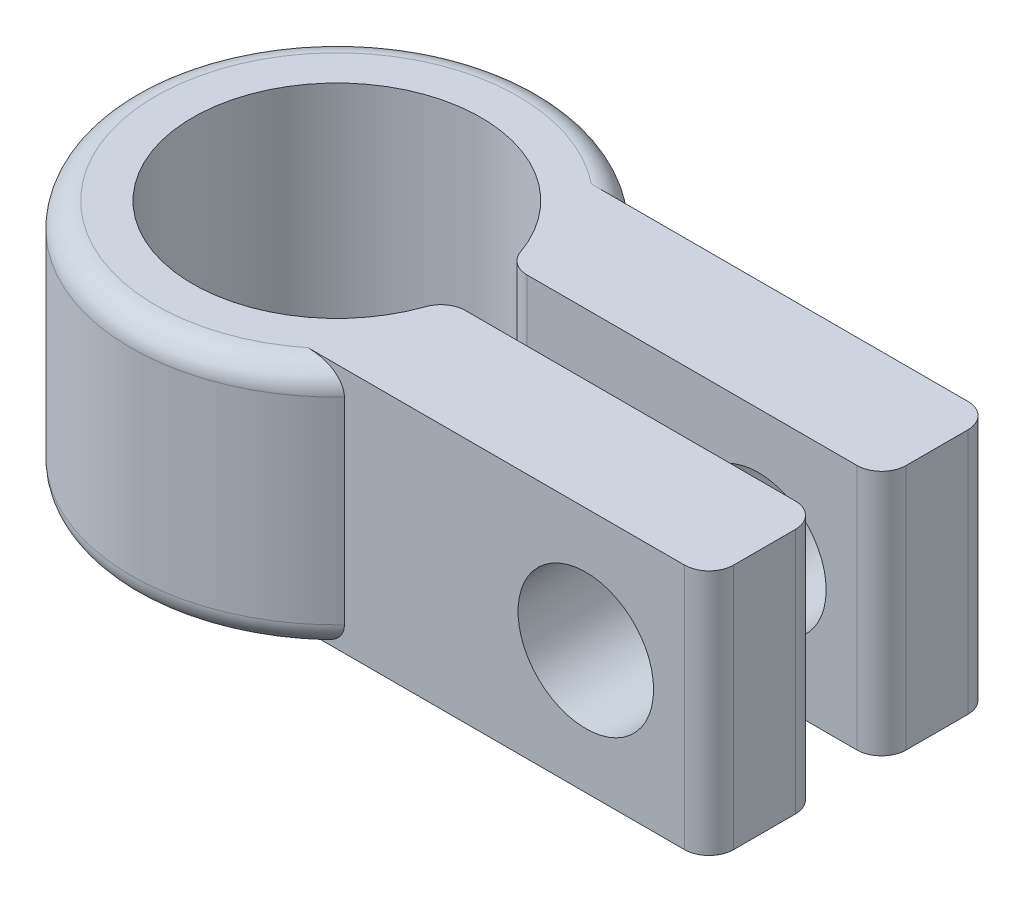
ISO-10303-21;
HEADER;
FILE_DESCRIPTION(('STEP AP214'),'2;1');
FILE_NAME('part.step','',(''),(''),'','','');
FILE_SCHEMA(('AUTOMOTIVE_DESIGN { 1 0 10303 214 1 1 1 1 }'));
ENDSEC;
DATA;
#1=APPLICATION_CONTEXT('core data for automotive mechanical design processes');
#2=APPLICATION_PROTOCOL_DEFINITION('international standard','automotive_design',2000,#1);
#3=PRODUCT_CONTEXT('',#1,'mechanical');
#4=PRODUCT('Part','Part','',(#3));
#5=PRODUCT_RELATED_PRODUCT_CATEGORY('part','',(#4));
#6=PRODUCT_DEFINITION_FORMATION('','',#4);
#7=PRODUCT_DEFINITION_CONTEXT('part definition',#1,'design');
#8=PRODUCT_DEFINITION('design','',#6,#7);
#9=PRODUCT_DEFINITION_SHAPE('','',#8);
#10=(LENGTH_UNIT() NAMED_UNIT(*) SI_UNIT(.MILLI.,.METRE.));
#11=(NAMED_UNIT(*) PLANE_ANGLE_UNIT() SI_UNIT($,.RADIAN.));
#12=(NAMED_UNIT(*) SI_UNIT($,.STERADIAN.) SOLID_ANGLE_UNIT());
#13=UNCERTAINTY_MEASURE_WITH_UNIT(LENGTH_MEASURE(1.E-05),#10,'distance_accuracy_value','');
#14=(GEOMETRIC_REPRESENTATION_CONTEXT(3) GLOBAL_UNCERTAINTY_ASSIGNED_CONTEXT((#13)) GLOBAL_UNIT_ASSIGNED_CONTEXT((#10,
#11,#12)) REPRESENTATION_CONTEXT('',''));
#15=CARTESIAN_POINT('',(0.,0.,0.));
#16=DIRECTION('',(0.,0.,1.));
#17=DIRECTION('',(1.,0.,0.));
#18=AXIS2_PLACEMENT_3D('',#15,#16,#17);
#19=CARTESIAN_POINT('',(0.,20.,0.));
#20=DIRECTION('',(0.,-1.,0.));
#21=DIRECTION('',(0.,0.,-1.));
#22=AXIS2_PLACEMENT_3D('',#19,#20,#21);
#23=CYLINDRICAL_SURFACE('',#22,16.7);
#24=DIRECTION('',(0.,-1.,0.));
#25=VECTOR('',#24,1.);
#26=CARTESIAN_POINT('',(12.1095004025765,20.,11.5));
#27=LINE('',#26,#25);
#28=CARTESIAN_POINT('',(12.1095004025765,18.,11.5));
#29=VERTEX_POINT('',#28);
#30=CARTESIAN_POINT('',(12.1095004025765,2.,11.5));
#31=VERTEX_POINT('',#30);
#32=EDGE_CURVE('E166',#29,#31,#27,.T.);
#33=ORIENTED_EDGE('',*,*,#32,.F.);
#34=CARTESIAN_POINT('',(0.,18.,0.));
#35=DIRECTION('',(0.,1.,0.));
#36=DIRECTION('',(0.,0.,1.));
#37=AXIS2_PLACEMENT_3D('',#34,#35,#36);
#38=CIRCLE('',#37,16.7);
#39=CARTESIAN_POINT('',(12.1095004025765,18.,-11.5));
#40=VERTEX_POINT('',#39);
#41=EDGE_CURVE('E268',#29,#40,#38,.F.);
#42=ORIENTED_EDGE('',*,*,#41,.T.);
#43=DIRECTION('',(0.,-1.,0.));
#44=VECTOR('',#43,1.);
#45=CARTESIAN_POINT('',(12.1095004025765,20.,-11.5));
#46=LINE('',#45,#44);
#47=CARTESIAN_POINT('',(12.1095004025765,2.,-11.5));
#48=VERTEX_POINT('',#47);
#49=EDGE_CURVE('E197',#40,#48,#46,.T.);
#50=ORIENTED_EDGE('',*,*,#49,.T.);
#51=CARTESIAN_POINT('',(0.,2.,0.));
#52=DIRECTION('',(0.,1.,0.));
#53=DIRECTION('',(0.,0.,1.));
#54=AXIS2_PLACEMENT_3D('',#51,#52,#53);
#55=CIRCLE('',#54,16.7);
#56=EDGE_CURVE('E265',#48,#31,#55,.T.);
#57=ORIENTED_EDGE('',*,*,#56,.T.);
#58=EDGE_LOOP('',(#33,#42,#50,#57));
#59=FACE_BOUND('',#58,.T.);
#60=ADVANCED_FACE('F33',(#59),#23,.T.);
#61=CARTESIAN_POINT('',(12.1095004025765,20.,11.5));
#62=DIRECTION('',(0.,0.,-1.));
#63=DIRECTION('',(-1.,0.,0.));
#64=AXIS2_PLACEMENT_3D('',#61,#62,#63);
#65=PLANE('',#64);
#66=CARTESIAN_POINT('',(31.7,10.,11.5));
#67=DIRECTION('',(0.,0.,1.));
#68=DIRECTION('',(1.,0.,0.));
#69=AXIS2_PLACEMENT_3D('',#66,#67,#68);
#70=CIRCLE('',#69,5.5);
#71=CARTESIAN_POINT('',(37.2,10.,11.5));
#72=VERTEX_POINT('',#71);
#73=EDGE_CURVE('E263',#72,#72,#70,.T.);
#74=ORIENTED_EDGE('',*,*,#73,.F.);
#75=EDGE_LOOP('',(#74));
#76=FACE_BOUND('',#75,.T.);
#77=DIRECTION('',(1.,0.,0.));
#78=VECTOR('',#77,1.);
#79=CARTESIAN_POINT('',(12.1095004025765,0.,11.5));
#80=LINE('',#79,#78);
#81=CARTESIAN_POINT('',(9.15641851380767,0.,11.5));
#82=VERTEX_POINT('',#81);
#83=CARTESIAN_POINT('',(39.7,0.,11.5));
#84=VERTEX_POINT('',#83);
#85=EDGE_CURVE('E54',#82,#84,#80,.T.);
#86=ORIENTED_EDGE('',*,*,#85,.T.);
#87=DIRECTION('',(0.,-1.,0.));
#88=VECTOR('',#87,1.);
#89=CARTESIAN_POINT('',(39.7,20.,11.5));
#90=LINE('',#89,#88);
#91=CARTESIAN_POINT('',(39.7,20.,11.5));
#92=VERTEX_POINT('',#91);
#93=EDGE_CURVE('E163',#92,#84,#90,.T.);
#94=ORIENTED_EDGE('',*,*,#93,.F.);
#95=DIRECTION('',(1.,0.,0.));
#96=VECTOR('',#95,1.);
#97=CARTESIAN_POINT('',(12.1095004025765,20.,11.5));
#98=LINE('',#97,#96);
#99=CARTESIAN_POINT('',(9.15641851380767,20.,11.5));
#100=VERTEX_POINT('',#99);
#101=EDGE_CURVE('E151',#100,#92,#98,.T.);
#102=ORIENTED_EDGE('',*,*,#101,.F.);
#103=CARTESIAN_POINT('',(9.15641851380767,20.,11.5));
#104=CARTESIAN_POINT('',(9.28356306798939,19.9999696319207,11.5));
#105=CARTESIAN_POINT('',(9.41079106363263,19.9952915068583,11.5));
#106=CARTESIAN_POINT('',(9.66491323847077,19.9756662108118,11.5));
#107=CARTESIAN_POINT('',(9.79180443553335,19.960681066205,11.5));
#108=CARTESIAN_POINT('',(10.0455258501019,19.9191713430374,11.5));
#109=CARTESIAN_POINT('',(10.1723313107817,19.8924911562396,11.5));
#110=CARTESIAN_POINT('',(10.4224047298147,19.8264095122484,11.5));
#111=CARTESIAN_POINT('',(10.545678333299,19.7870297494328,11.5));
#112=CARTESIAN_POINT('',(10.7943919480217,19.6913189245256,11.5));
#113=CARTESIAN_POINT('',(10.9194922999927,19.6340881539226,11.5));
#114=CARTESIAN_POINT('',(11.1598112848218,19.5023191448659,11.5));
#115=CARTESIAN_POINT('',(11.2750669569474,19.4278500806982,11.5));
#116=CARTESIAN_POINT('',(11.4712947664596,19.275739526671,11.5));
#117=CARTESIAN_POINT('',(11.5546688468214,19.2012184335252,11.5));
#118=CARTESIAN_POINT('',(11.7083529839742,19.0395880843982,11.5));
#119=CARTESIAN_POINT('',(11.7786715830557,18.9524871263217,11.5));
#120=CARTESIAN_POINT('',(11.8900640390694,18.7846320263965,11.5));
#121=CARTESIAN_POINT('',(11.9341622454615,18.7058898155199,11.5));
#122=CARTESIAN_POINT('',(12.0086678122206,18.5422338215167,11.5));
#123=CARTESIAN_POINT('',(12.0391017425135,18.4573323917635,11.5));
#124=CARTESIAN_POINT('',(12.0774502334485,18.3100829988482,11.5));
#125=CARTESIAN_POINT('',(12.0894038264795,18.2487671154302,11.5));
#126=CARTESIAN_POINT('',(12.1054576619413,18.1249867613589,11.5));
#127=CARTESIAN_POINT('',(12.1095410251237,18.062520111476,11.5));
#128=CARTESIAN_POINT('',(12.1095004025765,18.,11.5));
#129=B_SPLINE_CURVE_WITH_KNOTS('',3,(#103,#104,#105,#106,#107,#108,#109,#110,#111,#112,#113,
#114,#115,#116,#117,#118,#119,#120,#121,#122,#123,#124,#125,#126,#127,#128),.UNSPECIFIED.,.F.,
.F.,(4,2,2,2,2,2,2,2,2,2,2,2,4),(0.,0.381474536510774,0.76436210161846,1.15250659951628,
1.53999152102603,1.95150383942903,2.36139261101383,2.69565505066829,3.02969800335372,
3.29936330435631,3.56850195095638,3.75543442016846,3.94276735847457),.UNSPECIFIED.);
#130=EDGE_CURVE('E272',#100,#29,#129,.T.);
#131=ORIENTED_EDGE('',*,*,#130,.T.);
#132=ORIENTED_EDGE('',*,*,#32,.T.);
#133=CARTESIAN_POINT('',(12.1095004025765,2.,11.5));
#134=CARTESIAN_POINT('',(12.1095139399125,1.95493810100182,11.5));
#135=CARTESIAN_POINT('',(12.1074005982632,1.90988333986176,11.5));
#136=CARTESIAN_POINT('',(12.0990241619699,1.82018888291486,11.5));
#137=CARTESIAN_POINT('',(12.0927636848452,1.77554894329753,11.5));
#138=CARTESIAN_POINT('',(12.0762578027283,1.68735341343461,11.5));
#139=CARTESIAN_POINT('',(12.0660421121631,1.64379225566654,11.5));
#140=CARTESIAN_POINT('',(12.0418177913462,1.55774679926863,11.5));
#141=CARTESIAN_POINT('',(12.0278087509443,1.51526261762875,11.5));
#142=CARTESIAN_POINT('',(11.980492863178,1.39005542937594,11.5));
#143=CARTESIAN_POINT('',(11.9418425952591,1.30929626104611,11.5));
#144=CARTESIAN_POINT('',(11.8524671882281,1.15472297518221,11.5));
#145=CARTESIAN_POINT('',(11.8017188048149,1.0809226133941,11.5));
#146=CARTESIAN_POINT('',(11.6705078631555,0.91613660796,11.5));
#147=CARTESIAN_POINT('',(11.5859086831728,0.828440646845117,11.5));
#148=CARTESIAN_POINT('',(11.4037218645138,0.667918419706759,11.5));
#149=CARTESIAN_POINT('',(11.3061166121222,0.595112664072388,11.5));
#150=CARTESIAN_POINT('',(11.06114200248,0.437543283477132,11.5));
#151=CARTESIAN_POINT('',(10.9094318835044,0.359560211637933,11.5));
#152=CARTESIAN_POINT('',(10.5953473087202,0.228282590919733,11.5));
#153=CARTESIAN_POINT('',(10.432934224459,0.175083768191512,11.5));
#154=CARTESIAN_POINT('',(10.1767199935726,0.10957714597168,11.5));
#155=CARTESIAN_POINT('',(10.0847674215553,0.0896264838374899,11.5));
#156=CARTESIAN_POINT('',(9.89969038873713,0.0559492297660687,11.5));
#157=CARTESIAN_POINT('',(9.80656556697114,0.0422246056768422,11.5));
#158=CARTESIAN_POINT('',(9.62070132668874,0.0207142081399361,11.5));
#159=CARTESIAN_POINT('',(9.52796918057028,0.0128639489933513,11.5));
#160=CARTESIAN_POINT('',(9.34229094115412,0.00251374119330168,11.5));
#161=CARTESIAN_POINT('',(9.24934513158775,8.76080507428204E-06,11.5));
#162=CARTESIAN_POINT('',(9.15641851380767,0.,11.5));
#163=B_SPLINE_CURVE_WITH_KNOTS('',3,(#133,#134,#135,#136,#137,#138,#139,#140,#141,#142,#143,
#144,#145,#146,#147,#148,#149,#150,#151,#152,#153,#154,#155,#156,#157,#158,#159,#160,#161,#162),
.UNSPECIFIED.,.F.,.F.,(4,2,2,2,2,2,2,2,2,2,2,2,2,2,4),(0.,0.135124480070754,0.270163755698294,
0.404207611065856,0.538265965513923,0.805533834148014,1.07331940714892,1.43684790453432,
1.80087381789041,2.30983792409698,2.82075186970126,3.10284436451315,3.38502595756693,
3.66406253867347,3.942836334873),.UNSPECIFIED.);
#164=EDGE_CURVE('E47',#31,#82,#163,.T.);
#165=ORIENTED_EDGE('',*,*,#164,.T.);
#166=EDGE_LOOP('',(#86,#94,#102,#131,#132,#165));
#167=FACE_BOUND('',#166,.T.);
#168=ADVANCED_FACE('F164',(#76,#167),#65,.F.);
#169=CARTESIAN_POINT('',(39.7,20.,9.50000000000001));
#170=DIRECTION('',(0.,-1.,0.));
#171=DIRECTION('',(0.,0.,-1.));
#172=AXIS2_PLACEMENT_3D('',#169,#170,#171);
#173=CYLINDRICAL_SURFACE('',#172,2.);
#174=CARTESIAN_POINT('',(39.7,0.,9.50000000000001));
#175=DIRECTION('',(0.,1.,0.));
#176=DIRECTION('',(0.,0.,-1.));
#177=AXIS2_PLACEMENT_3D('',#174,#175,#176);
#178=CIRCLE('',#177,2.);
#179=CARTESIAN_POINT('',(41.7,0.,9.50000000000001));
#180=VERTEX_POINT('',#179);
#181=EDGE_CURVE('E199',#84,#180,#178,.T.);
#182=ORIENTED_EDGE('',*,*,#181,.T.);
#183=DIRECTION('',(0.,-1.,0.));
#184=VECTOR('',#183,1.);
#185=CARTESIAN_POINT('',(41.7,20.,9.50000000000001));
#186=LINE('',#185,#184);
#187=CARTESIAN_POINT('',(41.7,20.,9.50000000000001));
#188=VERTEX_POINT('',#187);
#189=EDGE_CURVE('E167',#188,#180,#186,.T.);
#190=ORIENTED_EDGE('',*,*,#189,.F.);
#191=CARTESIAN_POINT('',(39.7,20.,9.50000000000001));
#192=DIRECTION('',(0.,1.,0.));
#193=DIRECTION('',(0.,0.,-1.));
#194=AXIS2_PLACEMENT_3D('',#191,#192,#193);
#195=CIRCLE('',#194,2.);
#196=EDGE_CURVE('E155',#92,#188,#195,.T.);
#197=ORIENTED_EDGE('',*,*,#196,.F.);
#198=ORIENTED_EDGE('',*,*,#93,.T.);
#199=EDGE_LOOP('',(#182,#190,#197,#198));
#200=FACE_BOUND('',#199,.T.);
#201=ADVANCED_FACE('F169',(#200),#173,.T.);
#202=CARTESIAN_POINT('',(41.7,20.,9.50000000000001));
#203=DIRECTION('',(-1.,0.,0.));
#204=DIRECTION('',(0.,0.,1.));
#205=AXIS2_PLACEMENT_3D('',#202,#203,#204);
#206=PLANE('',#205);
#207=DIRECTION('',(0.,0.,-1.));
#208=VECTOR('',#207,1.);
#209=CARTESIAN_POINT('',(41.7,0.,9.50000000000001));
#210=LINE('',#209,#208);
#211=CARTESIAN_POINT('',(41.7,0.,4.5));
#212=VERTEX_POINT('',#211);
#213=EDGE_CURVE('E202',#180,#212,#210,.T.);
#214=ORIENTED_EDGE('',*,*,#213,.T.);
#215=DIRECTION('',(0.,-1.,0.));
#216=VECTOR('',#215,1.);
#217=CARTESIAN_POINT('',(41.7,20.,4.5));
#218=LINE('',#217,#216);
#219=CARTESIAN_POINT('',(41.7,20.,4.5));
#220=VERTEX_POINT('',#219);
#221=EDGE_CURVE('E253',#220,#212,#218,.T.);
#222=ORIENTED_EDGE('',*,*,#221,.F.);
#223=DIRECTION('',(0.,0.,-1.));
#224=VECTOR('',#223,1.);
#225=CARTESIAN_POINT('',(41.7,20.,9.50000000000001));
#226=LINE('',#225,#224);
#227=EDGE_CURVE('E172',#188,#220,#226,.T.);
#228=ORIENTED_EDGE('',*,*,#227,.F.);
#229=ORIENTED_EDGE('',*,*,#189,.T.);
#230=EDGE_LOOP('',(#214,#222,#228,#229));
#231=FACE_BOUND('',#230,.T.);
#232=ADVANCED_FACE('F361',(#231),#206,.F.);
#233=CARTESIAN_POINT('',(39.7,20.,4.5));
#234=DIRECTION('',(0.,-1.,0.));
#235=DIRECTION('',(0.,0.,-1.));
#236=AXIS2_PLACEMENT_3D('',#233,#234,#235);
#237=CYLINDRICAL_SURFACE('',#236,2.);
#238=CARTESIAN_POINT('',(39.7,0.,4.5));
#239=DIRECTION('',(0.,1.,0.));
#240=DIRECTION('',(0.,0.,1.));
#241=AXIS2_PLACEMENT_3D('',#238,#239,#240);
#242=CIRCLE('',#241,2.);
#243=CARTESIAN_POINT('',(39.7,0.,2.50000000000001));
#244=VERTEX_POINT('',#243);
#245=EDGE_CURVE('E204',#212,#244,#242,.T.);
#246=ORIENTED_EDGE('',*,*,#245,.T.);
#247=DIRECTION('',(0.,-1.,0.));
#248=VECTOR('',#247,1.);
#249=CARTESIAN_POINT('',(39.7,20.,2.50000000000001));
#250=LINE('',#249,#248);
#251=CARTESIAN_POINT('',(39.7,20.,2.50000000000001));
#252=VERTEX_POINT('',#251);
#253=EDGE_CURVE('E250',#252,#244,#250,.T.);
#254=ORIENTED_EDGE('',*,*,#253,.F.);
#255=CARTESIAN_POINT('',(39.7,20.,4.5));
#256=DIRECTION('',(0.,1.,0.));
#257=DIRECTION('',(0.,0.,1.));
#258=AXIS2_PLACEMENT_3D('',#255,#256,#257);
#259=CIRCLE('',#258,2.);
#260=EDGE_CURVE('E174',#220,#252,#259,.T.);
#261=ORIENTED_EDGE('',*,*,#260,.F.);
#262=ORIENTED_EDGE('',*,*,#221,.T.);
#263=EDGE_LOOP('',(#246,#254,#261,#262));
#264=FACE_BOUND('',#263,.T.);
#265=ADVANCED_FACE('F357',(#264),#237,.T.);
#266=CARTESIAN_POINT('',(13.7749773139559,20.,2.5));
#267=DIRECTION('',(0.,0.,1.));
#268=DIRECTION('',(1.,0.,0.));
#269=AXIS2_PLACEMENT_3D('',#266,#267,#268);
#270=PLANE('',#269);
#271=CARTESIAN_POINT('',(31.7,10.,2.5));
#272=DIRECTION('',(0.,0.,1.));
#273=DIRECTION('',(1.,0.,0.));
#274=AXIS2_PLACEMENT_3D('',#271,#272,#273);
#275=CIRCLE('',#274,5.5);
#276=CARTESIAN_POINT('',(37.2,10.,2.5));
#277=VERTEX_POINT('',#276);
#278=EDGE_CURVE('E200',#277,#277,#275,.T.);
#279=ORIENTED_EDGE('',*,*,#278,.T.);
#280=EDGE_LOOP('',(#279));
#281=FACE_BOUND('',#280,.T.);
#282=DIRECTION('',(-1.,0.,0.));
#283=VECTOR('',#282,1.);
#284=CARTESIAN_POINT('',(13.7749773139559,0.,2.5));
#285=LINE('',#284,#283);
#286=CARTESIAN_POINT('',(12.9398608956974,0.,2.5));
#287=VERTEX_POINT('',#286);
#288=EDGE_CURVE('E207',#244,#287,#285,.T.);
#289=ORIENTED_EDGE('',*,*,#288,.T.);
#290=DIRECTION('',(0.,-1.,0.));
#291=VECTOR('',#290,1.);
#292=CARTESIAN_POINT('',(12.9398608956974,20.,2.5));
#293=LINE('',#292,#291);
#294=CARTESIAN_POINT('',(12.9398608956974,20.,2.5));
#295=VERTEX_POINT('',#294);
#296=EDGE_CURVE('E247',#295,#287,#293,.T.);
#297=ORIENTED_EDGE('',*,*,#296,.F.);
#298=DIRECTION('',(-1.,0.,0.));
#299=VECTOR('',#298,1.);
#300=CARTESIAN_POINT('',(39.7,20.,2.50000000000001));
#301=LINE('',#300,#299);
#302=EDGE_CURVE('E179',#252,#295,#301,.T.);
#303=ORIENTED_EDGE('',*,*,#302,.F.);
#304=ORIENTED_EDGE('',*,*,#253,.T.);
#305=EDGE_LOOP('',(#289,#297,#303,#304));
#306=FACE_BOUND('',#305,.T.);
#307=ADVANCED_FACE('F353',(#281,#306),#270,.F.);
#308=CARTESIAN_POINT('',(12.9398608956974,20.,4.5));
#309=DIRECTION('',(0.,-1.,0.));
#310=DIRECTION('',(0.,0.,-1.));
#311=AXIS2_PLACEMENT_3D('',#308,#309,#310);
#312=CYLINDRICAL_SURFACE('',#311,2.);
#313=CARTESIAN_POINT('',(12.9398608956974,0.,4.5));
#314=DIRECTION('',(0.,1.,0.));
#315=DIRECTION('',(0.,0.,1.));
#316=AXIS2_PLACEMENT_3D('',#313,#314,#315);
#317=CIRCLE('',#316,2.);
#318=CARTESIAN_POINT('',(11.0508301080044,0.,3.84306569343066));
#319=VERTEX_POINT('',#318);
#320=EDGE_CURVE('E209',#287,#319,#317,.T.);
#321=ORIENTED_EDGE('',*,*,#320,.T.);
#322=DIRECTION('',(0.,-1.,0.));
#323=VECTOR('',#322,1.);
#324=CARTESIAN_POINT('',(11.0508301080044,20.,3.84306569343066));
#325=LINE('',#324,#323);
#326=CARTESIAN_POINT('',(11.0508301080044,20.,3.84306569343066));
#327=VERTEX_POINT('',#326);
#328=EDGE_CURVE('E244',#327,#319,#325,.T.);
#329=ORIENTED_EDGE('',*,*,#328,.F.);
#330=CARTESIAN_POINT('',(12.9398608956974,20.,4.5));
#331=DIRECTION('',(0.,1.,0.));
#332=DIRECTION('',(0.,0.,1.));
#333=AXIS2_PLACEMENT_3D('',#330,#331,#332);
#334=CIRCLE('',#333,2.);
#335=EDGE_CURVE('E181',#295,#327,#334,.T.);
#336=ORIENTED_EDGE('',*,*,#335,.F.);
#337=ORIENTED_EDGE('',*,*,#296,.T.);
#338=EDGE_LOOP('',(#321,#329,#336,#337));
#339=FACE_BOUND('',#338,.T.);
#340=ADVANCED_FACE('F349',(#339),#312,.T.);
#341=CARTESIAN_POINT('',(0.,20.,0.));
#342=DIRECTION('',(0.,-1.,0.));
#343=DIRECTION('',(0.,0.,-1.));
#344=AXIS2_PLACEMENT_3D('',#341,#342,#343);
#345=CYLINDRICAL_SURFACE('',#344,11.7);
#346=CARTESIAN_POINT('',(0.,0.,0.));
#347=DIRECTION('',(0.,-1.,0.));
#348=DIRECTION('',(0.,0.,1.));
#349=AXIS2_PLACEMENT_3D('',#346,#347,#348);
#350=CIRCLE('',#349,11.7);
#351=CARTESIAN_POINT('',(11.0508301080044,0.,-3.84306569343066));
#352=VERTEX_POINT('',#351);
#353=EDGE_CURVE('E211',#319,#352,#350,.T.);
#354=ORIENTED_EDGE('',*,*,#353,.T.);
#355=DIRECTION('',(0.,-1.,0.));
#356=VECTOR('',#355,1.);
#357=CARTESIAN_POINT('',(11.0508301080044,20.,-3.84306569343066));
#358=LINE('',#357,#356);
#359=CARTESIAN_POINT('',(11.0508301080044,20.,-3.84306569343066));
#360=VERTEX_POINT('',#359);
#361=EDGE_CURVE('E241',#360,#352,#358,.T.);
#362=ORIENTED_EDGE('',*,*,#361,.F.);
#363=CARTESIAN_POINT('',(0.,20.,0.));
#364=DIRECTION('',(0.,-1.,0.));
#365=DIRECTION('',(0.,0.,1.));
#366=AXIS2_PLACEMENT_3D('',#363,#364,#365);
#367=CIRCLE('',#366,11.7);
#368=EDGE_CURVE('E183',#327,#360,#367,.T.);
#369=ORIENTED_EDGE('',*,*,#368,.F.);
#370=ORIENTED_EDGE('',*,*,#328,.T.);
#371=EDGE_LOOP('',(#354,#362,#369,#370));
#372=FACE_BOUND('',#371,.T.);
#373=ADVANCED_FACE('F345',(#372),#345,.F.);
#374=CARTESIAN_POINT('',(12.9398608956974,20.,-4.5));
#375=DIRECTION('',(0.,-1.,0.));
#376=DIRECTION('',(0.,0.,-1.));
#377=AXIS2_PLACEMENT_3D('',#374,#375,#376);
#378=CYLINDRICAL_SURFACE('',#377,2.);
#379=CARTESIAN_POINT('',(12.9398608956974,0.,-4.5));
#380=DIRECTION('',(0.,1.,0.));
#381=DIRECTION('',(0.,0.,-1.));
#382=AXIS2_PLACEMENT_3D('',#379,#380,#381);
#383=CIRCLE('',#382,2.);
#384=CARTESIAN_POINT('',(12.9398608956974,0.,-2.5));
#385=VERTEX_POINT('',#384);
#386=EDGE_CURVE('E213',#352,#385,#383,.T.);
#387=ORIENTED_EDGE('',*,*,#386,.T.);
#388=DIRECTION('',(0.,-1.,0.));
#389=VECTOR('',#388,1.);
#390=CARTESIAN_POINT('',(12.9398608956974,20.,-2.5));
#391=LINE('',#390,#389);
#392=CARTESIAN_POINT('',(12.9398608956974,20.,-2.5));
#393=VERTEX_POINT('',#392);
#394=EDGE_CURVE('E238',#393,#385,#391,.T.);
#395=ORIENTED_EDGE('',*,*,#394,.F.);
#396=CARTESIAN_POINT('',(12.9398608956974,20.,-4.5));
#397=DIRECTION('',(0.,1.,0.));
#398=DIRECTION('',(0.,0.,-1.));
#399=AXIS2_PLACEMENT_3D('',#396,#397,#398);
#400=CIRCLE('',#399,2.);
#401=EDGE_CURVE('E185',#360,#393,#400,.T.);
#402=ORIENTED_EDGE('',*,*,#401,.F.);
#403=ORIENTED_EDGE('',*,*,#361,.T.);
#404=EDGE_LOOP('',(#387,#395,#402,#403));
#405=FACE_BOUND('',#404,.T.);
#406=ADVANCED_FACE('F336',(#405),#378,.T.);
#407=CARTESIAN_POINT('',(39.7,20.,-2.50000000000001));
#408=DIRECTION('',(0.,0.,-1.));
#409=DIRECTION('',(-1.,0.,0.));
#410=AXIS2_PLACEMENT_3D('',#407,#408,#409);
#411=PLANE('',#410);
#412=CARTESIAN_POINT('',(31.7,10.,-2.5));
#413=DIRECTION('',(0.,0.,-1.));
#414=DIRECTION('',(-1.,0.,0.));
#415=AXIS2_PLACEMENT_3D('',#412,#413,#414);
#416=CIRCLE('',#415,5.5);
#417=CARTESIAN_POINT('',(26.2,10.,-2.5));
#418=VERTEX_POINT('',#417);
#419=EDGE_CURVE('E259',#418,#418,#416,.T.);
#420=ORIENTED_EDGE('',*,*,#419,.T.);
#421=EDGE_LOOP('',(#420));
#422=FACE_BOUND('',#421,.T.);
#423=DIRECTION('',(1.,0.,0.));
#424=VECTOR('',#423,1.);
#425=CARTESIAN_POINT('',(39.7,0.,-2.50000000000001));
#426=LINE('',#425,#424);
#427=CARTESIAN_POINT('',(39.7,0.,-2.5));
#428=VERTEX_POINT('',#427);
#429=EDGE_CURVE('E216',#385,#428,#426,.T.);
#430=ORIENTED_EDGE('',*,*,#429,.T.);
#431=DIRECTION('',(0.,-1.,0.));
#432=VECTOR('',#431,1.);
#433=CARTESIAN_POINT('',(39.7,20.,-2.5));
#434=LINE('',#433,#432);
#435=CARTESIAN_POINT('',(39.7,20.,-2.5));
#436=VERTEX_POINT('',#435);
#437=EDGE_CURVE('E235',#436,#428,#434,.T.);
#438=ORIENTED_EDGE('',*,*,#437,.F.);
#439=DIRECTION('',(1.,0.,0.));
#440=VECTOR('',#439,1.);
#441=CARTESIAN_POINT('',(13.7749773139559,20.,-2.5));
#442=LINE('',#441,#440);
#443=EDGE_CURVE('E187',#393,#436,#442,.T.);
#444=ORIENTED_EDGE('',*,*,#443,.F.);
#445=ORIENTED_EDGE('',*,*,#394,.T.);
#446=EDGE_LOOP('',(#430,#438,#444,#445));
#447=FACE_BOUND('',#446,.T.);
#448=ADVANCED_FACE('F340',(#422,#447),#411,.F.);
#449=CARTESIAN_POINT('',(39.7,20.,-4.5));
#450=DIRECTION('',(0.,-1.,0.));
#451=DIRECTION('',(0.,0.,-1.));
#452=AXIS2_PLACEMENT_3D('',#449,#450,#451);
#453=CYLINDRICAL_SURFACE('',#452,2.);
#454=CARTESIAN_POINT('',(39.7,0.,-4.5));
#455=DIRECTION('',(0.,1.,0.));
#456=DIRECTION('',(0.,0.,-1.));
#457=AXIS2_PLACEMENT_3D('',#454,#455,#456);
#458=CIRCLE('',#457,2.);
#459=CARTESIAN_POINT('',(41.7,0.,-4.5));
#460=VERTEX_POINT('',#459);
#461=EDGE_CURVE('E218',#428,#460,#458,.T.);
#462=ORIENTED_EDGE('',*,*,#461,.T.);
#463=DIRECTION('',(0.,-1.,0.));
#464=VECTOR('',#463,1.);
#465=CARTESIAN_POINT('',(41.7,20.,-4.5));
#466=LINE('',#465,#464);
#467=CARTESIAN_POINT('',(41.7,20.,-4.5));
#468=VERTEX_POINT('',#467);
#469=EDGE_CURVE('E232',#468,#460,#466,.T.);
#470=ORIENTED_EDGE('',*,*,#469,.F.);
#471=CARTESIAN_POINT('',(39.7,20.,-4.5));
#472=DIRECTION('',(0.,1.,0.));
#473=DIRECTION('',(0.,0.,-1.));
#474=AXIS2_PLACEMENT_3D('',#471,#472,#473);
#475=CIRCLE('',#474,2.);
#476=EDGE_CURVE('E189',#436,#468,#475,.T.);
#477=ORIENTED_EDGE('',*,*,#476,.F.);
#478=ORIENTED_EDGE('',*,*,#437,.T.);
#479=EDGE_LOOP('',(#462,#470,#477,#478));
#480=FACE_BOUND('',#479,.T.);
#481=ADVANCED_FACE('F329',(#480),#453,.T.);
#482=CARTESIAN_POINT('',(41.7,20.,-9.50000000000001));
#483=DIRECTION('',(-1.,0.,0.));
#484=DIRECTION('',(0.,0.,1.));
#485=AXIS2_PLACEMENT_3D('',#482,#483,#484);
#486=PLANE('',#485);
#487=DIRECTION('',(0.,0.,-1.));
#488=VECTOR('',#487,1.);
#489=CARTESIAN_POINT('',(41.7,0.,-9.50000000000001));
#490=LINE('',#489,#488);
#491=CARTESIAN_POINT('',(41.7,0.,-9.50000000000001));
#492=VERTEX_POINT('',#491);
#493=EDGE_CURVE('E220',#460,#492,#490,.T.);
#494=ORIENTED_EDGE('',*,*,#493,.T.);
#495=DIRECTION('',(0.,-1.,0.));
#496=VECTOR('',#495,1.);
#497=CARTESIAN_POINT('',(41.7,20.,-9.50000000000001));
#498=LINE('',#497,#496);
#499=CARTESIAN_POINT('',(41.7,20.,-9.50000000000001));
#500=VERTEX_POINT('',#499);
#501=EDGE_CURVE('E229',#500,#492,#498,.T.);
#502=ORIENTED_EDGE('',*,*,#501,.F.);
#503=DIRECTION('',(0.,0.,-1.));
#504=VECTOR('',#503,1.);
#505=CARTESIAN_POINT('',(41.7,20.,-9.50000000000001));
#506=LINE('',#505,#504);
#507=EDGE_CURVE('E191',#468,#500,#506,.T.);
#508=ORIENTED_EDGE('',*,*,#507,.F.);
#509=ORIENTED_EDGE('',*,*,#469,.T.);
#510=EDGE_LOOP('',(#494,#502,#508,#509));
#511=FACE_BOUND('',#510,.T.);
#512=ADVANCED_FACE('F327',(#511),#486,.F.);
#513=CARTESIAN_POINT('',(39.7,20.,-9.50000000000001));
#514=DIRECTION('',(0.,-1.,0.));
#515=DIRECTION('',(0.,0.,-1.));
#516=AXIS2_PLACEMENT_3D('',#513,#514,#515);
#517=CYLINDRICAL_SURFACE('',#516,2.);
#518=CARTESIAN_POINT('',(39.7,0.,-9.50000000000001));
#519=DIRECTION('',(0.,1.,0.));
#520=DIRECTION('',(0.,0.,-1.));
#521=AXIS2_PLACEMENT_3D('',#518,#519,#520);
#522=CIRCLE('',#521,2.);
#523=CARTESIAN_POINT('',(39.7,0.,-11.5));
#524=VERTEX_POINT('',#523);
#525=EDGE_CURVE('E222',#492,#524,#522,.T.);
#526=ORIENTED_EDGE('',*,*,#525,.T.);
#527=DIRECTION('',(0.,-1.,0.));
#528=VECTOR('',#527,1.);
#529=CARTESIAN_POINT('',(39.7,20.,-11.5));
#530=LINE('',#529,#528);
#531=CARTESIAN_POINT('',(39.7,20.,-11.5));
#532=VERTEX_POINT('',#531);
#533=EDGE_CURVE('E227',#532,#524,#530,.T.);
#534=ORIENTED_EDGE('',*,*,#533,.F.);
#535=CARTESIAN_POINT('',(39.7,20.,-9.50000000000001));
#536=DIRECTION('',(0.,1.,0.));
#537=DIRECTION('',(0.,0.,-1.));
#538=AXIS2_PLACEMENT_3D('',#535,#536,#537);
#539=CIRCLE('',#538,2.);
#540=EDGE_CURVE('E193',#500,#532,#539,.T.);
#541=ORIENTED_EDGE('',*,*,#540,.F.);
#542=ORIENTED_EDGE('',*,*,#501,.T.);
#543=EDGE_LOOP('',(#526,#534,#541,#542));
#544=FACE_BOUND('',#543,.T.);
#545=ADVANCED_FACE('F319',(#544),#517,.T.);
#546=CARTESIAN_POINT('',(12.1095004025765,20.,-11.5));
#547=DIRECTION('',(0.,0.,1.));
#548=DIRECTION('',(1.,0.,0.));
#549=AXIS2_PLACEMENT_3D('',#546,#547,#548);
#550=PLANE('',#549);
#551=CARTESIAN_POINT('',(31.7,10.,-11.5));
#552=DIRECTION('',(0.,0.,1.));
#553=DIRECTION('',(1.,0.,0.));
#554=AXIS2_PLACEMENT_3D('',#551,#552,#553);
#555=CIRCLE('',#554,5.5);
#556=CARTESIAN_POINT('',(37.2,10.,-11.5));
#557=VERTEX_POINT('',#556);
#558=EDGE_CURVE('E262',#557,#557,#555,.T.);
#559=ORIENTED_EDGE('',*,*,#558,.T.);
#560=EDGE_LOOP('',(#559));
#561=FACE_BOUND('',#560,.T.);
#562=DIRECTION('',(-1.,0.,0.));
#563=VECTOR('',#562,1.);
#564=CARTESIAN_POINT('',(12.1095004025765,0.,-11.5));
#565=LINE('',#564,#563);
#566=CARTESIAN_POINT('',(9.15641851380767,0.,-11.5));
#567=VERTEX_POINT('',#566);
#568=EDGE_CURVE('E61',#524,#567,#565,.T.);
#569=ORIENTED_EDGE('',*,*,#568,.T.);
#570=CARTESIAN_POINT('',(9.15641851380767,0.,-11.5));
#571=CARTESIAN_POINT('',(9.28356306798939,3.03680792746207E-05,-11.5));
#572=CARTESIAN_POINT('',(9.41079106363263,0.00470849314168767,-11.5));
#573=CARTESIAN_POINT('',(9.66491323847077,0.0243337891882311,-11.5));
#574=CARTESIAN_POINT('',(9.79180443553335,0.0393189337949996,-11.5));
#575=CARTESIAN_POINT('',(10.0455258501018,0.0808286569625507,-11.5));
#576=CARTESIAN_POINT('',(10.1723313107817,0.107508843760396,-11.5));
#577=CARTESIAN_POINT('',(10.4224047298147,0.173590487751559,-11.5));
#578=CARTESIAN_POINT('',(10.545678333299,0.212970250567208,-11.5));
#579=CARTESIAN_POINT('',(10.7943919480217,0.308681075474356,-11.5));
#580=CARTESIAN_POINT('',(10.9194922999927,0.365911846077357,-11.5));
#581=CARTESIAN_POINT('',(11.1598112848218,0.497680855134083,-11.5));
#582=CARTESIAN_POINT('',(11.2750669569474,0.57214991930184,-11.5));
#583=CARTESIAN_POINT('',(11.4712947664596,0.724260473328953,-11.5));
#584=CARTESIAN_POINT('',(11.5546688468214,0.798781566474838,-11.5));
#585=CARTESIAN_POINT('',(11.7083529839742,0.960411915601791,-11.5));
#586=CARTESIAN_POINT('',(11.7786715830557,1.04751287367829,-11.5));
#587=CARTESIAN_POINT('',(11.8900640390694,1.21536797360355,-11.5));
#588=CARTESIAN_POINT('',(11.9341622454615,1.29411018448013,-11.5));
#589=CARTESIAN_POINT('',(12.0086678122206,1.45776617848334,-11.5));
#590=CARTESIAN_POINT('',(12.0391017425135,1.54266760823649,-11.5));
#591=CARTESIAN_POINT('',(12.0774502334485,1.68991700115183,-11.5));
#592=CARTESIAN_POINT('',(12.0894038264795,1.75123288456984,-11.5));
#593=CARTESIAN_POINT('',(12.1054576619413,1.87501323864108,-11.5));
#594=CARTESIAN_POINT('',(12.1095410251237,1.93747988852399,-11.5));
#595=CARTESIAN_POINT('',(12.1095004025765,2.,-11.5));
#596=B_SPLINE_CURVE_WITH_KNOTS('',3,(#570,#571,#572,#573,#574,#575,#576,#577,#578,#579,#580,
#581,#582,#583,#584,#585,#586,#587,#588,#589,#590,#591,#592,#593,#594,#595),.UNSPECIFIED.,.F.,
.F.,(4,2,2,2,2,2,2,2,2,2,2,2,4),(0.,0.381474536510774,0.764362101618457,1.15250659951627,
1.53999152102603,1.95150383942903,2.36139261101383,2.6956550506683,3.02969800335373,
3.2993633043563,3.56850195095638,3.75543442016846,3.94276735847458),.UNSPECIFIED.);
#597=EDGE_CURVE('E11',#567,#48,#596,.T.);
#598=ORIENTED_EDGE('',*,*,#597,.T.);
#599=ORIENTED_EDGE('',*,*,#49,.F.);
#600=CARTESIAN_POINT('',(12.1095004025765,18.,-11.5));
#601=CARTESIAN_POINT('',(12.1095139399125,18.0450618989982,-11.5));
#602=CARTESIAN_POINT('',(12.1074005982632,18.0901166601382,-11.5));
#603=CARTESIAN_POINT('',(12.0990241619699,18.1798111170851,-11.5));
#604=CARTESIAN_POINT('',(12.0927636848452,18.2244510567025,-11.5));
#605=CARTESIAN_POINT('',(12.0762578027283,18.3126465865654,-11.5));
#606=CARTESIAN_POINT('',(12.0660421121631,18.3562077443335,-11.5));
#607=CARTESIAN_POINT('',(12.0418177913462,18.4422532007314,-11.5));
#608=CARTESIAN_POINT('',(12.0278087509443,18.4847373823713,-11.5));
#609=CARTESIAN_POINT('',(11.980492863178,18.6099445706241,-11.5));
#610=CARTESIAN_POINT('',(11.9418425952591,18.6907037389539,-11.5));
#611=CARTESIAN_POINT('',(11.8524671882281,18.8452770248178,-11.5));
#612=CARTESIAN_POINT('',(11.8017188048149,18.9190773866059,-11.5));
#613=CARTESIAN_POINT('',(11.6705078631554,19.08386339204,-11.5));
#614=CARTESIAN_POINT('',(11.5859086831728,19.1715593531549,-11.5));
#615=CARTESIAN_POINT('',(11.4037218645138,19.3320815802932,-11.5));
#616=CARTESIAN_POINT('',(11.3061166121222,19.4048873359276,-11.5));
#617=CARTESIAN_POINT('',(11.06114200248,19.5624567165229,-11.5));
#618=CARTESIAN_POINT('',(10.9094318835044,19.6404397883621,-11.5));
#619=CARTESIAN_POINT('',(10.5953473087202,19.7717174090803,-11.5));
#620=CARTESIAN_POINT('',(10.432934224459,19.8249162318085,-11.5));
#621=CARTESIAN_POINT('',(10.1767199935726,19.8904228540283,-11.5));
#622=CARTESIAN_POINT('',(10.0847674215553,19.9103735161625,-11.5));
#623=CARTESIAN_POINT('',(9.89969038873713,19.9440507702339,-11.5));
#624=CARTESIAN_POINT('',(9.80656556697114,19.9577753943232,-11.5));
#625=CARTESIAN_POINT('',(9.62070132668874,19.9792857918601,-11.5));
#626=CARTESIAN_POINT('',(9.52796918057028,19.9871360510067,-11.5));
#627=CARTESIAN_POINT('',(9.34229094115412,19.9974862588067,-11.5));
#628=CARTESIAN_POINT('',(9.24934513158775,19.9999912391949,-11.5));
#629=CARTESIAN_POINT('',(9.15641851380767,20.,-11.5));
#630=B_SPLINE_CURVE_WITH_KNOTS('',3,(#600,#601,#602,#603,#604,#605,#606,#607,#608,#609,#610,
#611,#612,#613,#614,#615,#616,#617,#618,#619,#620,#621,#622,#623,#624,#625,#626,#627,#628,#629),
.UNSPECIFIED.,.F.,.F.,(4,2,2,2,2,2,2,2,2,2,2,2,2,2,4),(0.,0.135124480070756,0.270163755698295,
0.404207611065861,0.538265965513923,0.805533834148009,1.07331940714892,1.43684790453432,
1.80087381789042,2.30983792409698,2.82075186970126,3.10284436451314,3.38502595756693,
3.66406253867347,3.94283633487299),.UNSPECIFIED.);
#631=CARTESIAN_POINT('',(9.15641851380767,20.,-11.5));
#632=VERTEX_POINT('',#631);
#633=EDGE_CURVE('E279',#40,#632,#630,.T.);
#634=ORIENTED_EDGE('',*,*,#633,.T.);
#635=DIRECTION('',(-1.,0.,0.));
#636=VECTOR('',#635,1.);
#637=CARTESIAN_POINT('',(12.1095004025765,20.,-11.5));
#638=LINE('',#637,#636);
#639=EDGE_CURVE('E195',#532,#632,#638,.T.);
#640=ORIENTED_EDGE('',*,*,#639,.F.);
#641=ORIENTED_EDGE('',*,*,#533,.T.);
#642=EDGE_LOOP('',(#569,#598,#599,#634,#640,#641));
#643=FACE_BOUND('',#642,.T.);
#644=ADVANCED_FACE('F322',(#561,#643),#550,.F.);
#645=CARTESIAN_POINT('',(0.,20.,0.));
#646=DIRECTION('',(0.,1.,0.));
#647=DIRECTION('',(0.,0.,1.));
#648=AXIS2_PLACEMENT_3D('',#645,#646,#647);
#649=PLANE('',#648);
#650=CARTESIAN_POINT('',(0.,20.,0.));
#651=DIRECTION('',(0.,1.,0.));
#652=DIRECTION('',(0.,0.,1.));
#653=AXIS2_PLACEMENT_3D('',#650,#651,#652);
#654=CIRCLE('',#653,14.7);
#655=EDGE_CURVE('E158',#632,#100,#654,.T.);
#656=ORIENTED_EDGE('',*,*,#655,.T.);
#657=ORIENTED_EDGE('',*,*,#101,.T.);
#658=ORIENTED_EDGE('',*,*,#196,.T.);
#659=ORIENTED_EDGE('',*,*,#227,.T.);
#660=ORIENTED_EDGE('',*,*,#260,.T.);
#661=ORIENTED_EDGE('',*,*,#302,.T.);
#662=ORIENTED_EDGE('',*,*,#335,.T.);
#663=ORIENTED_EDGE('',*,*,#368,.T.);
#664=ORIENTED_EDGE('',*,*,#401,.T.);
#665=ORIENTED_EDGE('',*,*,#443,.T.);
#666=ORIENTED_EDGE('',*,*,#476,.T.);
#667=ORIENTED_EDGE('',*,*,#507,.T.);
#668=ORIENTED_EDGE('',*,*,#540,.T.);
#669=ORIENTED_EDGE('',*,*,#639,.T.);
#670=EDGE_LOOP('',(#656,#657,#658,#659,#660,#661,#662,#663,#664,#665,#666,#667,#668,#669));
#671=FACE_BOUND('',#670,.T.);
#672=ADVANCED_FACE('F153',(#671),#649,.T.);
#673=CARTESIAN_POINT('',(0.,0.,0.));
#674=DIRECTION('',(0.,1.,0.));
#675=DIRECTION('',(0.,0.,1.));
#676=AXIS2_PLACEMENT_3D('',#673,#674,#675);
#677=PLANE('',#676);
#678=ORIENTED_EDGE('',*,*,#85,.F.);
#679=CARTESIAN_POINT('',(0.,0.,0.));
#680=DIRECTION('',(0.,1.,0.));
#681=DIRECTION('',(0.,0.,1.));
#682=AXIS2_PLACEMENT_3D('',#679,#680,#681);
#683=CIRCLE('',#682,14.7);
#684=EDGE_CURVE('E270',#82,#567,#683,.F.);
#685=ORIENTED_EDGE('',*,*,#684,.T.);
#686=ORIENTED_EDGE('',*,*,#568,.F.);
#687=ORIENTED_EDGE('',*,*,#525,.F.);
#688=ORIENTED_EDGE('',*,*,#493,.F.);
#689=ORIENTED_EDGE('',*,*,#461,.F.);
#690=ORIENTED_EDGE('',*,*,#429,.F.);
#691=ORIENTED_EDGE('',*,*,#386,.F.);
#692=ORIENTED_EDGE('',*,*,#353,.F.);
#693=ORIENTED_EDGE('',*,*,#320,.F.);
#694=ORIENTED_EDGE('',*,*,#288,.F.);
#695=ORIENTED_EDGE('',*,*,#245,.F.);
#696=ORIENTED_EDGE('',*,*,#213,.F.);
#697=ORIENTED_EDGE('',*,*,#181,.F.);
#698=EDGE_LOOP('',(#678,#685,#686,#687,#688,#689,#690,#691,#692,#693,#694,#695,#696,#697));
#699=FACE_BOUND('',#698,.T.);
#700=ADVANCED_FACE('F313',(#699),#677,.F.);
#701=CARTESIAN_POINT('',(31.7,10.,11.5));
#702=DIRECTION('',(0.,0.,1.));
#703=DIRECTION('',(1.,0.,0.));
#704=AXIS2_PLACEMENT_3D('',#701,#702,#703);
#705=CYLINDRICAL_SURFACE('',#704,5.5);
#706=ORIENTED_EDGE('',*,*,#419,.F.);
#707=EDGE_LOOP('',(#706));
#708=FACE_BOUND('',#707,.T.);
#709=ORIENTED_EDGE('',*,*,#558,.F.);
#710=EDGE_LOOP('',(#709));
#711=FACE_BOUND('',#710,.T.);
#712=ADVANCED_FACE('F394',(#708,#711),#705,.F.);
#713=ORIENTED_EDGE('',*,*,#73,.T.);
#714=EDGE_LOOP('',(#713));
#715=FACE_BOUND('',#714,.T.);
#716=ORIENTED_EDGE('',*,*,#278,.F.);
#717=EDGE_LOOP('',(#716));
#718=FACE_BOUND('',#717,.T.);
#719=ADVANCED_FACE('F290',(#715,#718),#705,.F.);
#720=CARTESIAN_POINT('',(0.,18.,0.));
#721=DIRECTION('',(0.,1.,0.));
#722=DIRECTION('',(0.,0.,1.));
#723=AXIS2_PLACEMENT_3D('',#720,#721,#722);
#724=TOROIDAL_SURFACE('',#723,14.7,2.);
#725=ORIENTED_EDGE('',*,*,#633,.F.);
#726=ORIENTED_EDGE('',*,*,#41,.F.);
#727=ORIENTED_EDGE('',*,*,#130,.F.);
#728=ORIENTED_EDGE('',*,*,#655,.F.);
#729=EDGE_LOOP('',(#725,#726,#727,#728));
#730=FACE_BOUND('',#729,.T.);
#731=ADVANCED_FACE('F287',(#730),#724,.T.);
#732=CARTESIAN_POINT('',(0.,2.,0.));
#733=DIRECTION('',(0.,1.,0.));
#734=DIRECTION('',(0.,0.,1.));
#735=AXIS2_PLACEMENT_3D('',#732,#733,#734);
#736=TOROIDAL_SURFACE('',#735,14.7,2.);
#737=ORIENTED_EDGE('',*,*,#597,.F.);
#738=ORIENTED_EDGE('',*,*,#684,.F.);
#739=ORIENTED_EDGE('',*,*,#164,.F.);
#740=ORIENTED_EDGE('',*,*,#56,.F.);
#741=EDGE_LOOP('',(#737,#738,#739,#740));
#742=FACE_BOUND('',#741,.T.);
#743=ADVANCED_FACE('F35',(#742),#736,.T.);
#744=CLOSED_SHELL('',(#60,#168,#201,#232,#265,#307,#340,#373,#406,#448,#481,#512,#545,#644,#672,
#700,#712,#719,#731,#743));
#745=MANIFOLD_SOLID_BREP('B2',#744);
#746=ADVANCED_BREP_SHAPE_REPRESENTATION('',(#18,#745),#14);
#747=SHAPE_DEFINITION_REPRESENTATION(#9,#746);
ENDSEC;
END-ISO-10303-21;
